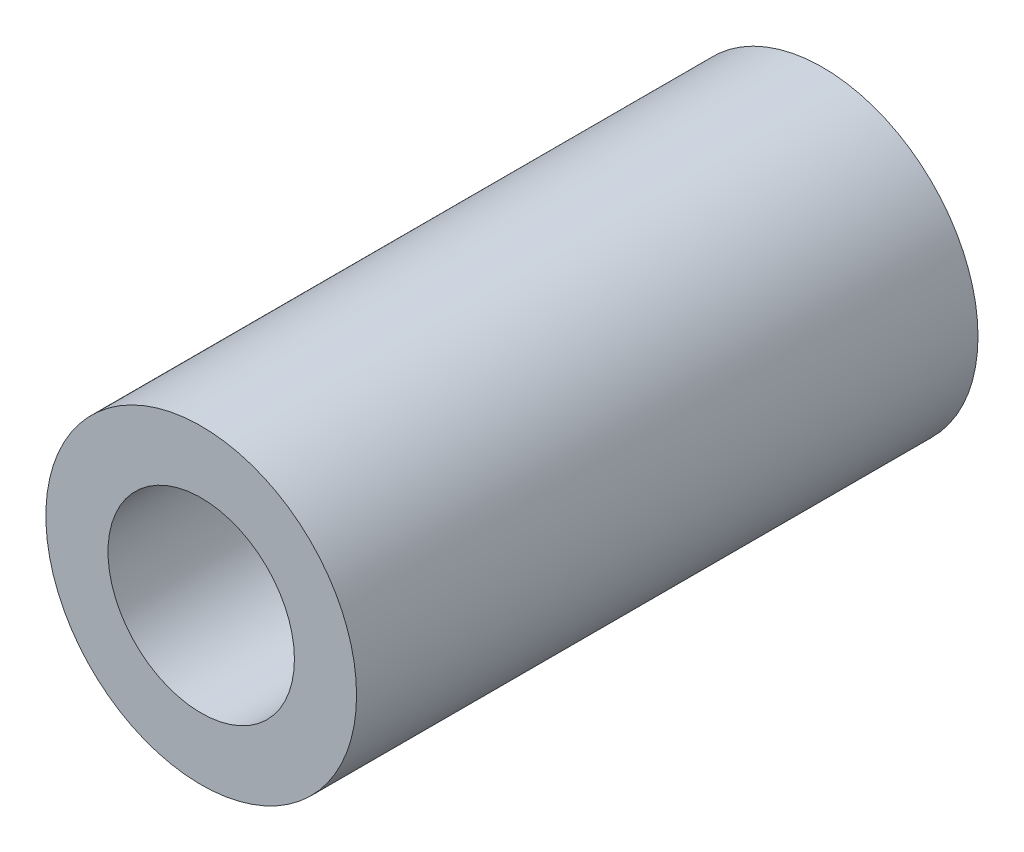
ISO-10303-21;
HEADER;
FILE_DESCRIPTION(('STEP AP214'),'2;1');
FILE_NAME('part.step','',(''),(''),'','','');
FILE_SCHEMA(('AUTOMOTIVE_DESIGN { 1 0 10303 214 1 1 1 1 }'));
ENDSEC;
DATA;
#1=APPLICATION_CONTEXT('core data for automotive mechanical design processes');
#2=APPLICATION_PROTOCOL_DEFINITION('international standard','automotive_design',2000,#1);
#3=PRODUCT_CONTEXT('',#1,'mechanical');
#4=PRODUCT('Part','Part','',(#3));
#5=PRODUCT_RELATED_PRODUCT_CATEGORY('part','',(#4));
#6=PRODUCT_DEFINITION_FORMATION('','',#4);
#7=PRODUCT_DEFINITION_CONTEXT('part definition',#1,'design');
#8=PRODUCT_DEFINITION('design','',#6,#7);
#9=PRODUCT_DEFINITION_SHAPE('','',#8);
#10=(LENGTH_UNIT() NAMED_UNIT(*) SI_UNIT(.MILLI.,.METRE.));
#11=(NAMED_UNIT(*) PLANE_ANGLE_UNIT() SI_UNIT($,.RADIAN.));
#12=(NAMED_UNIT(*) SI_UNIT($,.STERADIAN.) SOLID_ANGLE_UNIT());
#13=UNCERTAINTY_MEASURE_WITH_UNIT(LENGTH_MEASURE(1.E-05),#10,'distance_accuracy_value','');
#14=(GEOMETRIC_REPRESENTATION_CONTEXT(3) GLOBAL_UNCERTAINTY_ASSIGNED_CONTEXT((#13)) GLOBAL_UNIT_ASSIGNED_CONTEXT((#10,
#11,#12)) REPRESENTATION_CONTEXT('',''));
#15=CARTESIAN_POINT('',(0.,0.,0.));
#16=DIRECTION('',(0.,0.,1.));
#17=DIRECTION('',(1.,0.,0.));
#18=AXIS2_PLACEMENT_3D('',#15,#16,#17);
#19=CARTESIAN_POINT('',(0.,0.,5.));
#20=DIRECTION('',(0.,0.,1.));
#21=DIRECTION('',(1.,0.,0.));
#22=AXIS2_PLACEMENT_3D('',#19,#20,#21);
#23=PLANE('',#22);
#24=CARTESIAN_POINT('',(0.,0.,5.));
#25=DIRECTION('',(0.,0.,1.));
#26=DIRECTION('',(1.,0.,0.));
#27=AXIS2_PLACEMENT_3D('',#24,#25,#26);
#28=CIRCLE('',#27,2.5);
#29=CARTESIAN_POINT('',(2.5,0.,5.));
#30=VERTEX_POINT('',#29);
#31=EDGE_CURVE('E10',#30,#30,#28,.T.);
#32=ORIENTED_EDGE('',*,*,#31,.T.);
#33=EDGE_LOOP('',(#32));
#34=FACE_BOUND('',#33,.T.);
#35=CARTESIAN_POINT('',(0.,0.,5.));
#36=DIRECTION('',(0.,0.,1.));
#37=DIRECTION('',(1.,0.,0.));
#38=AXIS2_PLACEMENT_3D('',#35,#36,#37);
#39=CIRCLE('',#38,1.5);
#40=CARTESIAN_POINT('',(1.5,0.,5.));
#41=VERTEX_POINT('',#40);
#42=EDGE_CURVE('E44',#41,#41,#39,.T.);
#43=ORIENTED_EDGE('',*,*,#42,.F.);
#44=EDGE_LOOP('',(#43));
#45=FACE_BOUND('',#44,.T.);
#46=ADVANCED_FACE('F33',(#34,#45),#23,.T.);
#47=CARTESIAN_POINT('',(0.,0.,-5.));
#48=DIRECTION('',(0.,0.,1.));
#49=DIRECTION('',(1.,0.,0.));
#50=AXIS2_PLACEMENT_3D('',#47,#48,#49);
#51=PLANE('',#50);
#52=CARTESIAN_POINT('',(0.,0.,-5.));
#53=DIRECTION('',(0.,0.,1.));
#54=DIRECTION('',(1.,0.,0.));
#55=AXIS2_PLACEMENT_3D('',#52,#53,#54);
#56=CIRCLE('',#55,2.5);
#57=CARTESIAN_POINT('',(2.5,0.,-5.));
#58=VERTEX_POINT('',#57);
#59=EDGE_CURVE('E37',#58,#58,#56,.T.);
#60=ORIENTED_EDGE('',*,*,#59,.F.);
#61=EDGE_LOOP('',(#60));
#62=FACE_BOUND('',#61,.T.);
#63=CARTESIAN_POINT('',(0.,0.,-5.));
#64=DIRECTION('',(0.,0.,1.));
#65=DIRECTION('',(1.,0.,0.));
#66=AXIS2_PLACEMENT_3D('',#63,#64,#65);
#67=CIRCLE('',#66,1.5);
#68=CARTESIAN_POINT('',(1.5,0.,-5.));
#69=VERTEX_POINT('',#68);
#70=EDGE_CURVE('E46',#69,#69,#67,.T.);
#71=ORIENTED_EDGE('',*,*,#70,.T.);
#72=EDGE_LOOP('',(#71));
#73=FACE_BOUND('',#72,.T.);
#74=ADVANCED_FACE('F56',(#62,#73),#51,.F.);
#75=CARTESIAN_POINT('',(0.,0.,5.));
#76=DIRECTION('',(0.,0.,-1.));
#77=DIRECTION('',(-1.,0.,0.));
#78=AXIS2_PLACEMENT_3D('',#75,#76,#77);
#79=CYLINDRICAL_SURFACE('',#78,2.5);
#80=ORIENTED_EDGE('',*,*,#31,.F.);
#81=EDGE_LOOP('',(#80));
#82=FACE_BOUND('',#81,.T.);
#83=ORIENTED_EDGE('',*,*,#59,.T.);
#84=EDGE_LOOP('',(#83));
#85=FACE_BOUND('',#84,.T.);
#86=ADVANCED_FACE('F35',(#82,#85),#79,.T.);
#87=CARTESIAN_POINT('',(0.,0.,5.));
#88=DIRECTION('',(0.,0.,-1.));
#89=DIRECTION('',(-1.,0.,0.));
#90=AXIS2_PLACEMENT_3D('',#87,#88,#89);
#91=CYLINDRICAL_SURFACE('',#90,1.5);
#92=ORIENTED_EDGE('',*,*,#42,.T.);
#93=EDGE_LOOP('',(#92));
#94=FACE_BOUND('',#93,.T.);
#95=ORIENTED_EDGE('',*,*,#70,.F.);
#96=EDGE_LOOP('',(#95));
#97=FACE_BOUND('',#96,.T.);
#98=ADVANCED_FACE('F52',(#94,#97),#91,.F.);
#99=CLOSED_SHELL('',(#46,#74,#86,#98));
#100=MANIFOLD_SOLID_BREP('B2',#99);
#101=ADVANCED_BREP_SHAPE_REPRESENTATION('',(#18,#100),#14);
#102=SHAPE_DEFINITION_REPRESENTATION(#9,#101);
ENDSEC;
END-ISO-10303-21;
